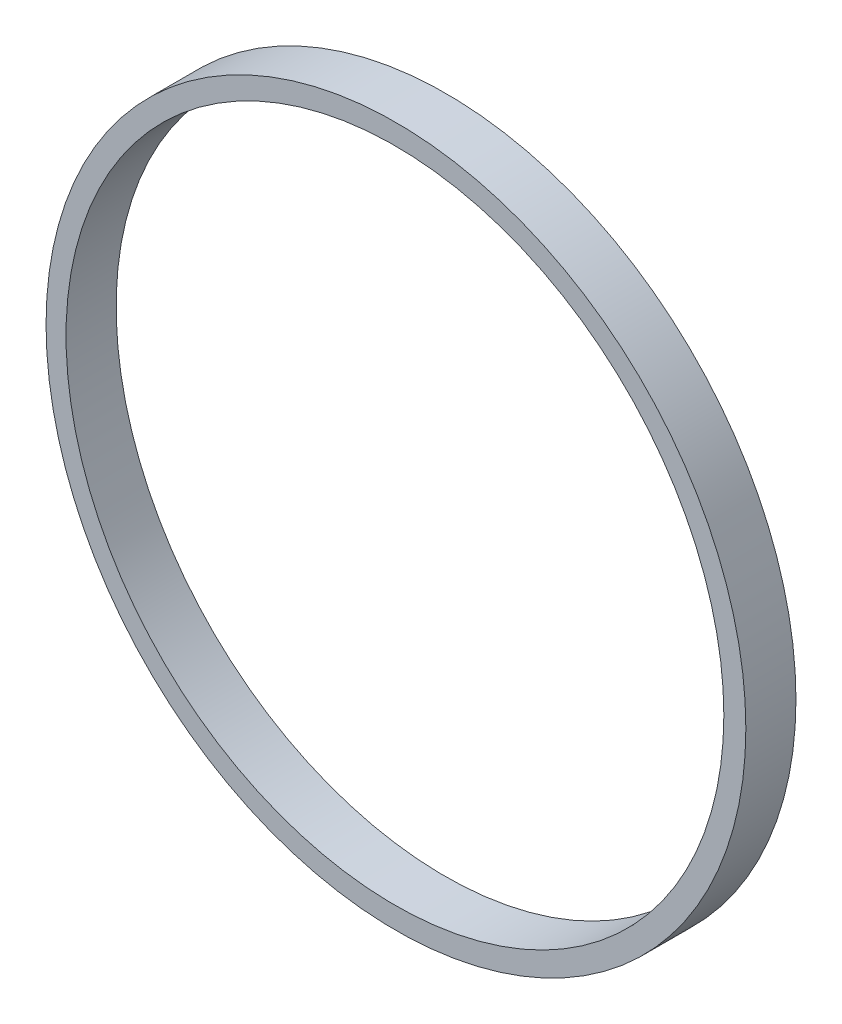
ISO-10303-21;
HEADER;
FILE_DESCRIPTION(('STEP AP214'),'2;1');
FILE_NAME('part.step','',(''),(''),'','','');
FILE_SCHEMA(('AUTOMOTIVE_DESIGN { 1 0 10303 214 1 1 1 1 }'));
ENDSEC;
DATA;
#1=APPLICATION_CONTEXT('core data for automotive mechanical design processes');
#2=APPLICATION_PROTOCOL_DEFINITION('international standard','automotive_design',2000,#1);
#3=PRODUCT_CONTEXT('',#1,'mechanical');
#4=PRODUCT('Part','Part','',(#3));
#5=PRODUCT_RELATED_PRODUCT_CATEGORY('part','',(#4));
#6=PRODUCT_DEFINITION_FORMATION('','',#4);
#7=PRODUCT_DEFINITION_CONTEXT('part definition',#1,'design');
#8=PRODUCT_DEFINITION('design','',#6,#7);
#9=PRODUCT_DEFINITION_SHAPE('','',#8);
#10=(LENGTH_UNIT() NAMED_UNIT(*) SI_UNIT(.MILLI.,.METRE.));
#11=(NAMED_UNIT(*) PLANE_ANGLE_UNIT() SI_UNIT($,.RADIAN.));
#12=(NAMED_UNIT(*) SI_UNIT($,.STERADIAN.) SOLID_ANGLE_UNIT());
#13=UNCERTAINTY_MEASURE_WITH_UNIT(LENGTH_MEASURE(1.E-05),#10,'distance_accuracy_value','');
#14=(GEOMETRIC_REPRESENTATION_CONTEXT(3) GLOBAL_UNCERTAINTY_ASSIGNED_CONTEXT((#13)) GLOBAL_UNIT_ASSIGNED_CONTEXT((#10,
#11,#12)) REPRESENTATION_CONTEXT('',''));
#15=CARTESIAN_POINT('',(0.,0.,0.));
#16=DIRECTION('',(0.,0.,1.));
#17=DIRECTION('',(1.,0.,0.));
#18=AXIS2_PLACEMENT_3D('',#15,#16,#17);
#19=CARTESIAN_POINT('',(1.20146771143137E-05,0.00183567864775296,-27.0699909937554));
#20=DIRECTION('',(-1.02259922170748E-13,0.,1.));
#21=DIRECTION('',(-1.,0.,-1.02259922170748E-13));
#22=AXIS2_PLACEMENT_3D('',#19,#20,#21);
#23=CYLINDRICAL_SURFACE('',#22,35.25);
#24=CARTESIAN_POINT('',(1.20146775202856E-05,0.00183567864789558,-31.0399907324573));
#25=DIRECTION('',(1.02259922170748E-13,0.,-1.));
#26=DIRECTION('',(-1.,0.,-1.02259922170748E-13));
#27=AXIS2_PLACEMENT_3D('',#24,#25,#26);
#28=CIRCLE('',#27,35.25);
#29=CARTESIAN_POINT('',(35.2500120146775,0.00183567864789989,-31.0399907324537));
#30=VERTEX_POINT('',#29);
#31=EDGE_CURVE('E11',#30,#30,#28,.T.);
#32=ORIENTED_EDGE('',*,*,#31,.T.);
#33=EDGE_LOOP('',(#32));
#34=FACE_BOUND('',#33,.T.);
#35=CARTESIAN_POINT('',(1.20146769711498E-05,0.00183567864770266,-25.6699909937554));
#36=DIRECTION('',(1.02259922170748E-13,0.,-1.));
#37=DIRECTION('',(-1.,0.,-1.02259922170748E-13));
#38=AXIS2_PLACEMENT_3D('',#35,#36,#37);
#39=CIRCLE('',#38,35.25);
#40=CARTESIAN_POINT('',(35.250012014677,0.00183567864770698,-25.6699909937518));
#41=VERTEX_POINT('',#40);
#42=EDGE_CURVE('E21',#41,#41,#39,.T.);
#43=ORIENTED_EDGE('',*,*,#42,.F.);
#44=EDGE_LOOP('',(#43));
#45=FACE_BOUND('',#44,.T.);
#46=ADVANCED_FACE('F17',(#34,#45),#23,.F.);
#47=CARTESIAN_POINT('',(0.108004329323942,-0.0375670954855488,-27.0699909937554));
#48=DIRECTION('',(-1.02259922170748E-13,0.,1.));
#49=DIRECTION('',(-1.,0.,-1.02259922170748E-13));
#50=AXIS2_PLACEMENT_3D('',#47,#48,#49);
#51=CYLINDRICAL_SURFACE('',#50,37.5);
#52=CARTESIAN_POINT('',(0.108004329324348,-0.0375670954854062,-31.0399907324573));
#53=DIRECTION('',(-1.02259922170748E-13,0.,1.));
#54=DIRECTION('',(-1.,0.,-1.02259922170748E-13));
#55=AXIS2_PLACEMENT_3D('',#52,#53,#54);
#56=CIRCLE('',#55,37.5);
#57=CARTESIAN_POINT('',(37.6080043293243,-0.0375670954854108,-31.0399907324534));
#58=VERTEX_POINT('',#57);
#59=EDGE_CURVE('E28',#58,#58,#56,.T.);
#60=ORIENTED_EDGE('',*,*,#59,.T.);
#61=EDGE_LOOP('',(#60));
#62=FACE_BOUND('',#61,.T.);
#63=CARTESIAN_POINT('',(0.108004329323799,-0.0375670954855991,-25.6699909937554));
#64=DIRECTION('',(1.02259922170748E-13,0.,-1.));
#65=DIRECTION('',(-1.,0.,-1.02259922170748E-13));
#66=AXIS2_PLACEMENT_3D('',#63,#64,#65);
#67=CIRCLE('',#66,37.5);
#68=CARTESIAN_POINT('',(37.6080043293238,-0.0375670954856037,-25.6699909937515));
#69=VERTEX_POINT('',#68);
#70=EDGE_CURVE('E43',#69,#69,#67,.T.);
#71=ORIENTED_EDGE('',*,*,#70,.T.);
#72=EDGE_LOOP('',(#71));
#73=FACE_BOUND('',#72,.T.);
#74=ADVANCED_FACE('F59',(#62,#73),#51,.T.);
#75=CARTESIAN_POINT('',(0.108004329324348,-0.0375670954854062,-31.0399907324573));
#76=DIRECTION('',(1.02259922170748E-13,0.,-1.));
#77=DIRECTION('',(-0.999999738175226,-0.000723636289364295,-1.02285891626961E-13));
#78=AXIS2_PLACEMENT_3D('',#75,#76,#77);
#79=PLANE('',#78);
#80=ORIENTED_EDGE('',*,*,#59,.F.);
#81=EDGE_LOOP('',(#80));
#82=FACE_BOUND('',#81,.T.);
#83=ORIENTED_EDGE('',*,*,#31,.F.);
#84=EDGE_LOOP('',(#83));
#85=FACE_BOUND('',#84,.T.);
#86=ADVANCED_FACE('F19',(#82,#85),#79,.T.);
#87=CARTESIAN_POINT('',(0.108004329323799,-0.0375670954855991,-25.6699909937554));
#88=DIRECTION('',(1.02259922170748E-13,0.,-1.));
#89=DIRECTION('',(-0.999999738175226,-0.000723636289364295,-1.02285891626961E-13));
#90=AXIS2_PLACEMENT_3D('',#87,#88,#89);
#91=PLANE('',#90);
#92=ORIENTED_EDGE('',*,*,#70,.F.);
#93=EDGE_LOOP('',(#92));
#94=FACE_BOUND('',#93,.T.);
#95=ORIENTED_EDGE('',*,*,#42,.T.);
#96=EDGE_LOOP('',(#95));
#97=FACE_BOUND('',#96,.T.);
#98=ADVANCED_FACE('F44',(#94,#97),#91,.F.);
#99=CLOSED_SHELL('',(#46,#74,#86,#98));
#100=MANIFOLD_SOLID_BREP('B1',#99);
#101=ADVANCED_BREP_SHAPE_REPRESENTATION('',(#18,#100),#14);
#102=SHAPE_DEFINITION_REPRESENTATION(#9,#101);
ENDSEC;
END-ISO-10303-21;
